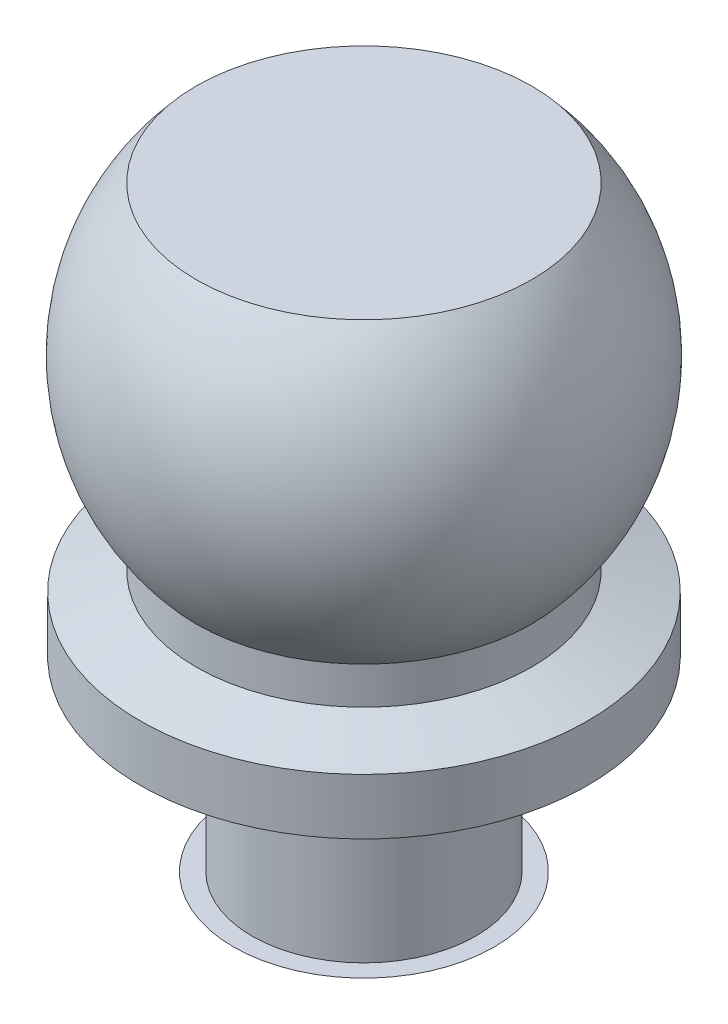
ISO-10303-21;
HEADER;
FILE_DESCRIPTION(('STEP AP214'),'2;1');
FILE_NAME('part.step','',(''),(''),'','','');
FILE_SCHEMA(('AUTOMOTIVE_DESIGN { 1 0 10303 214 1 1 1 1 }'));
ENDSEC;
DATA;
#1=APPLICATION_CONTEXT('core data for automotive mechanical design processes');
#2=APPLICATION_PROTOCOL_DEFINITION('international standard','automotive_design',2000,#1);
#3=PRODUCT_CONTEXT('',#1,'mechanical');
#4=PRODUCT('Part','Part','',(#3));
#5=PRODUCT_RELATED_PRODUCT_CATEGORY('part','',(#4));
#6=PRODUCT_DEFINITION_FORMATION('','',#4);
#7=PRODUCT_DEFINITION_CONTEXT('part definition',#1,'design');
#8=PRODUCT_DEFINITION('design','',#6,#7);
#9=PRODUCT_DEFINITION_SHAPE('','',#8);
#10=(LENGTH_UNIT() NAMED_UNIT(*) SI_UNIT(.MILLI.,.METRE.));
#11=(NAMED_UNIT(*) PLANE_ANGLE_UNIT() SI_UNIT($,.RADIAN.));
#12=(NAMED_UNIT(*) SI_UNIT($,.STERADIAN.) SOLID_ANGLE_UNIT());
#13=UNCERTAINTY_MEASURE_WITH_UNIT(LENGTH_MEASURE(1.E-05),#10,'distance_accuracy_value','');
#14=(GEOMETRIC_REPRESENTATION_CONTEXT(3) GLOBAL_UNCERTAINTY_ASSIGNED_CONTEXT((#13)) GLOBAL_UNIT_ASSIGNED_CONTEXT((#10,
#11,#12)) REPRESENTATION_CONTEXT('',''));
#15=CARTESIAN_POINT('',(0.,0.,0.));
#16=DIRECTION('',(0.,0.,1.));
#17=DIRECTION('',(1.,0.,0.));
#18=AXIS2_PLACEMENT_3D('',#15,#16,#17);
#19=CARTESIAN_POINT('',(0.,55.9445512683698,0.));
#20=DIRECTION('',(0.,-1.,0.));
#21=DIRECTION('',(-1.,0.,0.));
#22=AXIS2_PLACEMENT_3D('',#19,#20,#21);
#23=SPHERICAL_SURFACE('',#22,6.62500000000031);
#24=CARTESIAN_POINT('',(0.,50.3195512683695,0.));
#25=DIRECTION('',(0.,-1.,0.));
#26=DIRECTION('',(0.,0.,-1.));
#27=AXIS2_PLACEMENT_3D('',#24,#25,#26);
#28=CIRCLE('',#27,3.5);
#29=CARTESIAN_POINT('',(0.,50.3195512683695,-3.5));
#30=VERTEX_POINT('',#29);
#31=EDGE_CURVE('E10',#30,#30,#28,.T.);
#32=ORIENTED_EDGE('',*,*,#31,.T.);
#33=EDGE_LOOP('',(#32));
#34=FACE_BOUND('',#33,.T.);
#35=ADVANCED_FACE('F368',(#34),#23,.T.);
#36=CARTESIAN_POINT('',(-2.99999999999999,50.3195512683695,0.));
#37=DIRECTION('',(0.,-1.,0.));
#38=DIRECTION('',(0.,0.,-1.));
#39=AXIS2_PLACEMENT_3D('',#36,#37,#38);
#40=PLANE('',#39);
#41=ORIENTED_EDGE('',*,*,#31,.F.);
#42=EDGE_LOOP('',(#41));
#43=FACE_BOUND('',#42,.T.);
#44=CARTESIAN_POINT('',(0.,50.3195512683695,0.));
#45=DIRECTION('',(0.,-1.,0.));
#46=DIRECTION('',(0.,0.,-1.));
#47=AXIS2_PLACEMENT_3D('',#44,#45,#46);
#48=CIRCLE('',#47,2.99999999999999);
#49=CARTESIAN_POINT('',(0.,50.3195512683695,-2.99999999999999));
#50=VERTEX_POINT('',#49);
#51=EDGE_CURVE('E374',#50,#50,#48,.T.);
#52=ORIENTED_EDGE('',*,*,#51,.T.);
#53=EDGE_LOOP('',(#52));
#54=FACE_BOUND('',#53,.T.);
#55=ADVANCED_FACE('F412',(#43,#54),#40,.F.);
#56=CARTESIAN_POINT('',(0.,0.,0.));
#57=DIRECTION('',(0.,-1.,0.));
#58=DIRECTION('',(0.,0.,-1.));
#59=AXIS2_PLACEMENT_3D('',#56,#57,#58);
#60=CYLINDRICAL_SURFACE('',#59,2.99999999999999);
#61=ORIENTED_EDGE('',*,*,#51,.F.);
#62=EDGE_LOOP('',(#61));
#63=FACE_BOUND('',#62,.T.);
#64=CARTESIAN_POINT('',(0.,55.3195512683695,0.));
#65=DIRECTION('',(0.,-1.,0.));
#66=DIRECTION('',(0.,0.,-1.));
#67=AXIS2_PLACEMENT_3D('',#64,#65,#66);
#68=CIRCLE('',#67,2.99999999999999);
#69=CARTESIAN_POINT('',(0.,55.3195512683695,-2.99999999999999));
#70=VERTEX_POINT('',#69);
#71=EDGE_CURVE('E378',#70,#70,#68,.T.);
#72=ORIENTED_EDGE('',*,*,#71,.T.);
#73=EDGE_LOOP('',(#72));
#74=FACE_BOUND('',#73,.T.);
#75=ADVANCED_FACE('F416',(#63,#74),#60,.T.);
#76=CARTESIAN_POINT('',(-2.99999999999999,55.3195512683695,0.));
#77=DIRECTION('',(0.,1.,0.));
#78=DIRECTION('',(0.,0.,1.));
#79=AXIS2_PLACEMENT_3D('',#76,#77,#78);
#80=PLANE('',#79);
#81=ORIENTED_EDGE('',*,*,#71,.F.);
#82=EDGE_LOOP('',(#81));
#83=FACE_BOUND('',#82,.T.);
#84=CARTESIAN_POINT('',(0.,55.3195512683695,0.));
#85=DIRECTION('',(0.,-1.,0.));
#86=DIRECTION('',(0.,0.,-1.));
#87=AXIS2_PLACEMENT_3D('',#84,#85,#86);
#88=CIRCLE('',#87,5.99999999999999);
#89=CARTESIAN_POINT('',(0.,55.3195512683695,-5.99999999999999));
#90=VERTEX_POINT('',#89);
#91=EDGE_CURVE('E382',#90,#90,#88,.T.);
#92=ORIENTED_EDGE('',*,*,#91,.T.);
#93=EDGE_LOOP('',(#92));
#94=FACE_BOUND('',#93,.T.);
#95=ADVANCED_FACE('F421',(#83,#94),#80,.F.);
#96=CARTESIAN_POINT('',(0.,0.,0.));
#97=DIRECTION('',(0.,-1.,0.));
#98=DIRECTION('',(0.,0.,-1.));
#99=AXIS2_PLACEMENT_3D('',#96,#97,#98);
#100=CYLINDRICAL_SURFACE('',#99,5.99999999999999);
#101=ORIENTED_EDGE('',*,*,#91,.F.);
#102=EDGE_LOOP('',(#101));
#103=FACE_BOUND('',#102,.T.);
#104=CARTESIAN_POINT('',(0.,56.8195512683695,0.));
#105=DIRECTION('',(0.,-1.,0.));
#106=DIRECTION('',(0.,0.,-1.));
#107=AXIS2_PLACEMENT_3D('',#104,#105,#106);
#108=CIRCLE('',#107,5.99999999999999);
#109=CARTESIAN_POINT('',(0.,56.8195512683695,-5.99999999999999));
#110=VERTEX_POINT('',#109);
#111=EDGE_CURVE('E387',#110,#110,#108,.T.);
#112=ORIENTED_EDGE('',*,*,#111,.T.);
#113=EDGE_LOOP('',(#112));
#114=FACE_BOUND('',#113,.T.);
#115=ADVANCED_FACE('F427',(#103,#114),#100,.T.);
#116=CARTESIAN_POINT('',(0.,57.3195512683695,0.));
#117=DIRECTION('',(0.,-1.,0.));
#118=DIRECTION('',(0.,0.,-1.));
#119=AXIS2_PLACEMENT_3D('',#116,#117,#118);
#120=CONICAL_SURFACE('',#119,4.49999999999999,1.24904577239825);
#121=ORIENTED_EDGE('',*,*,#111,.F.);
#122=EDGE_LOOP('',(#121));
#123=FACE_BOUND('',#122,.T.);
#124=CARTESIAN_POINT('',(0.,57.3195512683695,0.));
#125=DIRECTION('',(0.,-1.,0.));
#126=DIRECTION('',(0.,0.,-1.));
#127=AXIS2_PLACEMENT_3D('',#124,#125,#126);
#128=CIRCLE('',#127,4.49999999999999);
#129=CARTESIAN_POINT('',(0.,57.3195512683695,-4.49999999999999));
#130=VERTEX_POINT('',#129);
#131=EDGE_CURVE('E390',#130,#130,#128,.T.);
#132=ORIENTED_EDGE('',*,*,#131,.T.);
#133=EDGE_LOOP('',(#132));
#134=FACE_BOUND('',#133,.T.);
#135=ADVANCED_FACE('F431',(#123,#134),#120,.T.);
#136=CARTESIAN_POINT('',(0.,0.,0.));
#137=DIRECTION('',(0.,-1.,0.));
#138=DIRECTION('',(0.,0.,-1.));
#139=AXIS2_PLACEMENT_3D('',#136,#137,#138);
#140=CYLINDRICAL_SURFACE('',#139,4.5);
#141=ORIENTED_EDGE('',*,*,#131,.F.);
#142=EDGE_LOOP('',(#141));
#143=FACE_BOUND('',#142,.T.);
#144=CARTESIAN_POINT('',(0.,58.3195512683695,0.));
#145=DIRECTION('',(0.,-1.,0.));
#146=DIRECTION('',(0.,0.,-1.));
#147=AXIS2_PLACEMENT_3D('',#144,#145,#146);
#148=CIRCLE('',#147,4.5);
#149=CARTESIAN_POINT('',(0.,58.3195512683695,-4.5));
#150=VERTEX_POINT('',#149);
#151=EDGE_CURVE('E393',#150,#150,#148,.T.);
#152=ORIENTED_EDGE('',*,*,#151,.T.);
#153=EDGE_LOOP('',(#152));
#154=FACE_BOUND('',#153,.T.);
#155=ADVANCED_FACE('F408',(#143,#154),#140,.T.);
#156=CARTESIAN_POINT('',(0.,62.3195512683695,0.));
#157=DIRECTION('',(0.,-1.,0.));
#158=DIRECTION('',(0.,0.,-1.));
#159=AXIS2_PLACEMENT_3D('',#156,#157,#158);
#160=DEGENERATE_TOROIDAL_SURFACE('',#159,0.0278640450004451,6.,.T.);
#161=ORIENTED_EDGE('',*,*,#151,.F.);
#162=EDGE_LOOP('',(#161));
#163=FACE_BOUND('',#162,.T.);
#164=CARTESIAN_POINT('',(0.,66.3195512683696,0.));
#165=DIRECTION('',(0.,-1.,0.));
#166=DIRECTION('',(0.,0.,-1.));
#167=AXIS2_PLACEMENT_3D('',#164,#165,#166);
#168=CIRCLE('',#167,4.5);
#169=CARTESIAN_POINT('',(0.,66.3195512683696,-4.5));
#170=VERTEX_POINT('',#169);
#171=EDGE_CURVE('E396',#170,#170,#168,.T.);
#172=ORIENTED_EDGE('',*,*,#171,.T.);
#173=EDGE_LOOP('',(#172));
#174=FACE_BOUND('',#173,.T.);
#175=ADVANCED_FACE('F400',(#163,#174),#160,.T.);
#176=CARTESIAN_POINT('',(-4.5,66.3195512683696,0.));
#177=DIRECTION('',(0.,-1.,0.));
#178=DIRECTION('',(0.,0.,-1.));
#179=AXIS2_PLACEMENT_3D('',#176,#177,#178);
#180=PLANE('',#179);
#181=ORIENTED_EDGE('',*,*,#171,.F.);
#182=EDGE_LOOP('',(#181));
#183=FACE_BOUND('',#182,.T.);
#184=ADVANCED_FACE('F402',(#183),#180,.F.);
#185=CLOSED_SHELL('',(#35,#55,#75,#95,#115,#135,#155,#175,#184));
#186=MANIFOLD_SOLID_BREP('B2',#185);
#187=ADVANCED_BREP_SHAPE_REPRESENTATION('',(#18,#186),#14);
#188=SHAPE_DEFINITION_REPRESENTATION(#9,#187);
ENDSEC;
END-ISO-10303-21;
